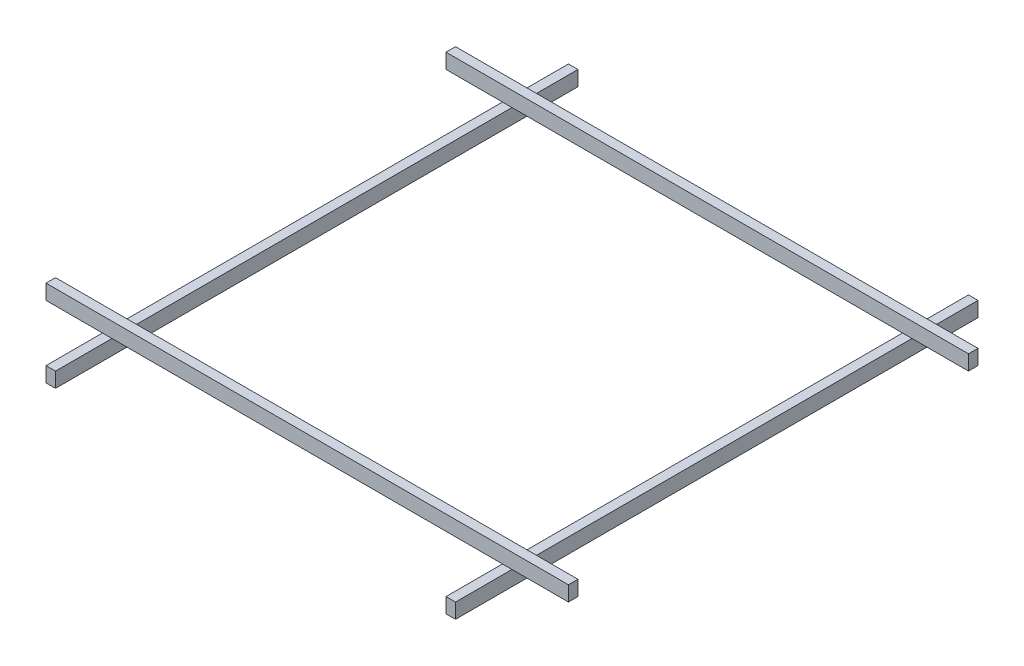
ISO-10303-21;
HEADER;
FILE_DESCRIPTION(('STEP AP214'),'2;1');
FILE_NAME('part.step','',(''),(''),'','','');
FILE_SCHEMA(('AUTOMOTIVE_DESIGN { 1 0 10303 214 1 1 1 1 }'));
ENDSEC;
DATA;
#1=APPLICATION_CONTEXT('core data for automotive mechanical design processes');
#2=APPLICATION_PROTOCOL_DEFINITION('international standard','automotive_design',2000,#1);
#3=PRODUCT_CONTEXT('',#1,'mechanical');
#4=PRODUCT('Part','Part','',(#3));
#5=PRODUCT_RELATED_PRODUCT_CATEGORY('part','',(#4));
#6=PRODUCT_DEFINITION_FORMATION('','',#4);
#7=PRODUCT_DEFINITION_CONTEXT('part definition',#1,'design');
#8=PRODUCT_DEFINITION('design','',#6,#7);
#9=PRODUCT_DEFINITION_SHAPE('','',#8);
#10=(LENGTH_UNIT() NAMED_UNIT(*) SI_UNIT(.MILLI.,.METRE.));
#11=(NAMED_UNIT(*) PLANE_ANGLE_UNIT() SI_UNIT($,.RADIAN.));
#12=(NAMED_UNIT(*) SI_UNIT($,.STERADIAN.) SOLID_ANGLE_UNIT());
#13=UNCERTAINTY_MEASURE_WITH_UNIT(LENGTH_MEASURE(1.E-05),#10,'distance_accuracy_value','');
#14=(GEOMETRIC_REPRESENTATION_CONTEXT(3) GLOBAL_UNCERTAINTY_ASSIGNED_CONTEXT((#13)) GLOBAL_UNIT_ASSIGNED_CONTEXT((#10,
#11,#12)) REPRESENTATION_CONTEXT('',''));
#15=CARTESIAN_POINT('',(0.,0.,0.));
#16=DIRECTION('',(0.,0.,1.));
#17=DIRECTION('',(1.,0.,0.));
#18=AXIS2_PLACEMENT_3D('',#15,#16,#17);
#19=CARTESIAN_POINT('',(4572.,209.55,-615.95));
#20=DIRECTION('',(0.,0.,1.));
#21=DIRECTION('',(1.,0.,0.));
#22=AXIS2_PLACEMENT_3D('',#19,#20,#21);
#23=PLANE('',#22);
#24=DIRECTION('',(0.,1.,0.));
#25=VECTOR('',#24,1.);
#26=CARTESIAN_POINT('',(-304.8,209.55,-615.95));
#27=LINE('',#26,#25);
#28=CARTESIAN_POINT('',(-304.8,69.85,-615.95));
#29=VERTEX_POINT('',#28);
#30=CARTESIAN_POINT('',(-304.8,209.55,-615.95));
#31=VERTEX_POINT('',#30);
#32=EDGE_CURVE('E141',#29,#31,#27,.T.);
#33=ORIENTED_EDGE('',*,*,#32,.T.);
#34=DIRECTION('',(-1.,0.,0.));
#35=VECTOR('',#34,1.);
#36=CARTESIAN_POINT('',(4572.,209.55,-615.95));
#37=LINE('',#36,#35);
#38=CARTESIAN_POINT('',(4572.,209.55,-615.95));
#39=VERTEX_POINT('',#38);
#40=EDGE_CURVE('E13',#39,#31,#37,.T.);
#41=ORIENTED_EDGE('',*,*,#40,.F.);
#42=DIRECTION('',(0.,1.,0.));
#43=VECTOR('',#42,1.);
#44=CARTESIAN_POINT('',(4572.,209.55,-615.95));
#45=LINE('',#44,#43);
#46=CARTESIAN_POINT('',(4572.,69.85,-615.95));
#47=VERTEX_POINT('',#46);
#48=EDGE_CURVE('E125',#47,#39,#45,.T.);
#49=ORIENTED_EDGE('',*,*,#48,.F.);
#50=DIRECTION('',(-1.,0.,0.));
#51=VECTOR('',#50,1.);
#52=CARTESIAN_POINT('',(4572.,69.85,-615.95));
#53=LINE('',#52,#51);
#54=EDGE_CURVE('E137',#47,#29,#53,.T.);
#55=ORIENTED_EDGE('',*,*,#54,.T.);
#56=EDGE_LOOP('',(#33,#41,#49,#55));
#57=FACE_BOUND('',#56,.T.);
#58=ADVANCED_FACE('F69',(#57),#23,.F.);
#59=CARTESIAN_POINT('',(4572.,209.55,-527.05));
#60=DIRECTION('',(0.,-1.,0.));
#61=DIRECTION('',(0.,0.,-1.));
#62=AXIS2_PLACEMENT_3D('',#59,#60,#61);
#63=PLANE('',#62);
#64=DIRECTION('',(0.,0.,1.));
#65=VECTOR('',#64,1.);
#66=CARTESIAN_POINT('',(-304.8,209.55,-527.05));
#67=LINE('',#66,#65);
#68=CARTESIAN_POINT('',(-304.8,209.55,-527.05));
#69=VERTEX_POINT('',#68);
#70=EDGE_CURVE('E130',#31,#69,#67,.T.);
#71=ORIENTED_EDGE('',*,*,#70,.T.);
#72=DIRECTION('',(-1.,0.,0.));
#73=VECTOR('',#72,1.);
#74=CARTESIAN_POINT('',(4572.,209.55,-527.05));
#75=LINE('',#74,#73);
#76=CARTESIAN_POINT('',(4572.,209.55,-527.05));
#77=VERTEX_POINT('',#76);
#78=EDGE_CURVE('E78',#77,#69,#75,.T.);
#79=ORIENTED_EDGE('',*,*,#78,.F.);
#80=DIRECTION('',(0.,0.,1.));
#81=VECTOR('',#80,1.);
#82=CARTESIAN_POINT('',(4572.,209.55,-527.05));
#83=LINE('',#82,#81);
#84=EDGE_CURVE('E120',#39,#77,#83,.T.);
#85=ORIENTED_EDGE('',*,*,#84,.F.);
#86=ORIENTED_EDGE('',*,*,#40,.T.);
#87=EDGE_LOOP('',(#71,#79,#85,#86));
#88=FACE_BOUND('',#87,.T.);
#89=ADVANCED_FACE('F129',(#88),#63,.F.);
#90=CARTESIAN_POINT('',(4572.,209.55,-527.05));
#91=DIRECTION('',(0.,0.,-1.));
#92=DIRECTION('',(-1.,0.,0.));
#93=AXIS2_PLACEMENT_3D('',#90,#91,#92);
#94=PLANE('',#93);
#95=DIRECTION('',(0.,-1.,0.));
#96=VECTOR('',#95,1.);
#97=CARTESIAN_POINT('',(-304.8,209.55,-527.05));
#98=LINE('',#97,#96);
#99=CARTESIAN_POINT('',(-304.8,69.85,-527.05));
#100=VERTEX_POINT('',#99);
#101=EDGE_CURVE('E107',#69,#100,#98,.T.);
#102=ORIENTED_EDGE('',*,*,#101,.T.);
#103=DIRECTION('',(-1.,0.,0.));
#104=VECTOR('',#103,1.);
#105=CARTESIAN_POINT('',(4572.,69.85,-527.05));
#106=LINE('',#105,#104);
#107=CARTESIAN_POINT('',(4572.,69.85,-527.05));
#108=VERTEX_POINT('',#107);
#109=EDGE_CURVE('E132',#108,#100,#106,.T.);
#110=ORIENTED_EDGE('',*,*,#109,.F.);
#111=DIRECTION('',(0.,-1.,0.));
#112=VECTOR('',#111,1.);
#113=CARTESIAN_POINT('',(4572.,209.55,-527.05));
#114=LINE('',#113,#112);
#115=EDGE_CURVE('E123',#77,#108,#114,.T.);
#116=ORIENTED_EDGE('',*,*,#115,.F.);
#117=ORIENTED_EDGE('',*,*,#78,.T.);
#118=EDGE_LOOP('',(#102,#110,#116,#117));
#119=FACE_BOUND('',#118,.T.);
#120=ADVANCED_FACE('F133',(#119),#94,.F.);
#121=CARTESIAN_POINT('',(4572.,69.85,-527.05));
#122=DIRECTION('',(0.,1.,0.));
#123=DIRECTION('',(0.,0.,1.));
#124=AXIS2_PLACEMENT_3D('',#121,#122,#123);
#125=PLANE('',#124);
#126=DIRECTION('',(0.,0.,-1.));
#127=VECTOR('',#126,1.);
#128=CARTESIAN_POINT('',(-304.8,69.85,-527.05));
#129=LINE('',#128,#127);
#130=EDGE_CURVE('E113',#100,#29,#129,.T.);
#131=ORIENTED_EDGE('',*,*,#130,.T.);
#132=ORIENTED_EDGE('',*,*,#54,.F.);
#133=DIRECTION('',(0.,0.,-1.));
#134=VECTOR('',#133,1.);
#135=CARTESIAN_POINT('',(4572.,69.85,-527.05));
#136=LINE('',#135,#134);
#137=EDGE_CURVE('E89',#108,#47,#136,.T.);
#138=ORIENTED_EDGE('',*,*,#137,.F.);
#139=ORIENTED_EDGE('',*,*,#109,.T.);
#140=EDGE_LOOP('',(#131,#132,#138,#139));
#141=FACE_BOUND('',#140,.T.);
#142=ADVANCED_FACE('F150',(#141),#125,.F.);
#143=CARTESIAN_POINT('',(4572.,139.7,-838.2));
#144=DIRECTION('',(1.,0.,0.));
#145=DIRECTION('',(0.,0.,-1.));
#146=AXIS2_PLACEMENT_3D('',#143,#144,#145);
#147=PLANE('',#146);
#148=ORIENTED_EDGE('',*,*,#48,.T.);
#149=ORIENTED_EDGE('',*,*,#84,.T.);
#150=ORIENTED_EDGE('',*,*,#115,.T.);
#151=ORIENTED_EDGE('',*,*,#137,.T.);
#152=EDGE_LOOP('',(#148,#149,#150,#151));
#153=FACE_BOUND('',#152,.T.);
#154=ADVANCED_FACE('F121',(#153),#147,.T.);
#155=CARTESIAN_POINT('',(-304.8,139.7,-838.2));
#156=DIRECTION('',(1.,0.,0.));
#157=DIRECTION('',(0.,0.,-1.));
#158=AXIS2_PLACEMENT_3D('',#155,#156,#157);
#159=PLANE('',#158);
#160=ORIENTED_EDGE('',*,*,#32,.F.);
#161=ORIENTED_EDGE('',*,*,#130,.F.);
#162=ORIENTED_EDGE('',*,*,#101,.F.);
#163=ORIENTED_EDGE('',*,*,#70,.F.);
#164=EDGE_LOOP('',(#160,#161,#162,#163));
#165=FACE_BOUND('',#164,.T.);
#166=ADVANCED_FACE('F153',(#165),#159,.F.);
#167=CLOSED_SHELL('',(#58,#89,#120,#142,#154,#166));
#168=MANIFOLD_SOLID_BREP('B2',#167);
#169=CARTESIAN_POINT('',(4572.,209.55,-4349.75));
#170=DIRECTION('',(0.,0.,1.));
#171=DIRECTION('',(1.,0.,0.));
#172=AXIS2_PLACEMENT_3D('',#169,#170,#171);
#173=PLANE('',#172);
#174=DIRECTION('',(0.,1.,0.));
#175=VECTOR('',#174,1.);
#176=CARTESIAN_POINT('',(-304.8,209.55,-4349.75));
#177=LINE('',#176,#175);
#178=CARTESIAN_POINT('',(-304.8,69.85,-4349.75));
#179=VERTEX_POINT('',#178);
#180=CARTESIAN_POINT('',(-304.8,209.55,-4349.75));
#181=VERTEX_POINT('',#180);
#182=EDGE_CURVE('E317',#179,#181,#177,.T.);
#183=ORIENTED_EDGE('',*,*,#182,.T.);
#184=DIRECTION('',(-1.,0.,0.));
#185=VECTOR('',#184,1.);
#186=CARTESIAN_POINT('',(4572.,209.55,-4349.75));
#187=LINE('',#186,#185);
#188=CARTESIAN_POINT('',(4572.,209.55,-4349.75));
#189=VERTEX_POINT('',#188);
#190=EDGE_CURVE('E67',#189,#181,#187,.T.);
#191=ORIENTED_EDGE('',*,*,#190,.F.);
#192=DIRECTION('',(0.,1.,0.));
#193=VECTOR('',#192,1.);
#194=CARTESIAN_POINT('',(4572.,209.55,-4349.75));
#195=LINE('',#194,#193);
#196=CARTESIAN_POINT('',(4572.,69.85,-4349.75));
#197=VERTEX_POINT('',#196);
#198=EDGE_CURVE('E301',#197,#189,#195,.T.);
#199=ORIENTED_EDGE('',*,*,#198,.F.);
#200=DIRECTION('',(-1.,0.,0.));
#201=VECTOR('',#200,1.);
#202=CARTESIAN_POINT('',(4572.,69.85,-4349.75));
#203=LINE('',#202,#201);
#204=EDGE_CURVE('E313',#197,#179,#203,.T.);
#205=ORIENTED_EDGE('',*,*,#204,.T.);
#206=EDGE_LOOP('',(#183,#191,#199,#205));
#207=FACE_BOUND('',#206,.T.);
#208=ADVANCED_FACE('F241',(#207),#173,.F.);
#209=CARTESIAN_POINT('',(4572.,209.55,-4260.85));
#210=DIRECTION('',(0.,-1.,0.));
#211=DIRECTION('',(0.,0.,-1.));
#212=AXIS2_PLACEMENT_3D('',#209,#210,#211);
#213=PLANE('',#212);
#214=DIRECTION('',(0.,0.,1.));
#215=VECTOR('',#214,1.);
#216=CARTESIAN_POINT('',(-304.8,209.55,-4260.85));
#217=LINE('',#216,#215);
#218=CARTESIAN_POINT('',(-304.8,209.55,-4260.85));
#219=VERTEX_POINT('',#218);
#220=EDGE_CURVE('E306',#181,#219,#217,.T.);
#221=ORIENTED_EDGE('',*,*,#220,.T.);
#222=DIRECTION('',(-1.,0.,0.));
#223=VECTOR('',#222,1.);
#224=CARTESIAN_POINT('',(4572.,209.55,-4260.85));
#225=LINE('',#224,#223);
#226=CARTESIAN_POINT('',(4572.,209.55,-4260.85));
#227=VERTEX_POINT('',#226);
#228=EDGE_CURVE('E250',#227,#219,#225,.T.);
#229=ORIENTED_EDGE('',*,*,#228,.F.);
#230=DIRECTION('',(0.,0.,1.));
#231=VECTOR('',#230,1.);
#232=CARTESIAN_POINT('',(4572.,209.55,-4260.85));
#233=LINE('',#232,#231);
#234=EDGE_CURVE('E296',#189,#227,#233,.T.);
#235=ORIENTED_EDGE('',*,*,#234,.F.);
#236=ORIENTED_EDGE('',*,*,#190,.T.);
#237=EDGE_LOOP('',(#221,#229,#235,#236));
#238=FACE_BOUND('',#237,.T.);
#239=ADVANCED_FACE('F305',(#238),#213,.F.);
#240=CARTESIAN_POINT('',(4572.,209.55,-4260.85));
#241=DIRECTION('',(0.,0.,-1.));
#242=DIRECTION('',(-1.,0.,0.));
#243=AXIS2_PLACEMENT_3D('',#240,#241,#242);
#244=PLANE('',#243);
#245=DIRECTION('',(0.,-1.,0.));
#246=VECTOR('',#245,1.);
#247=CARTESIAN_POINT('',(-304.8,209.55,-4260.85));
#248=LINE('',#247,#246);
#249=CARTESIAN_POINT('',(-304.8,69.85,-4260.85));
#250=VERTEX_POINT('',#249);
#251=EDGE_CURVE('E283',#219,#250,#248,.T.);
#252=ORIENTED_EDGE('',*,*,#251,.T.);
#253=DIRECTION('',(-1.,0.,0.));
#254=VECTOR('',#253,1.);
#255=CARTESIAN_POINT('',(4572.,69.85,-4260.85));
#256=LINE('',#255,#254);
#257=CARTESIAN_POINT('',(4572.,69.85,-4260.85));
#258=VERTEX_POINT('',#257);
#259=EDGE_CURVE('E308',#258,#250,#256,.T.);
#260=ORIENTED_EDGE('',*,*,#259,.F.);
#261=DIRECTION('',(0.,-1.,0.));
#262=VECTOR('',#261,1.);
#263=CARTESIAN_POINT('',(4572.,209.55,-4260.85));
#264=LINE('',#263,#262);
#265=EDGE_CURVE('E299',#227,#258,#264,.T.);
#266=ORIENTED_EDGE('',*,*,#265,.F.);
#267=ORIENTED_EDGE('',*,*,#228,.T.);
#268=EDGE_LOOP('',(#252,#260,#266,#267));
#269=FACE_BOUND('',#268,.T.);
#270=ADVANCED_FACE('F309',(#269),#244,.F.);
#271=CARTESIAN_POINT('',(4572.,69.85,-4260.85));
#272=DIRECTION('',(0.,1.,0.));
#273=DIRECTION('',(0.,0.,1.));
#274=AXIS2_PLACEMENT_3D('',#271,#272,#273);
#275=PLANE('',#274);
#276=DIRECTION('',(0.,0.,-1.));
#277=VECTOR('',#276,1.);
#278=CARTESIAN_POINT('',(-304.8,69.85,-4260.85));
#279=LINE('',#278,#277);
#280=EDGE_CURVE('E289',#250,#179,#279,.T.);
#281=ORIENTED_EDGE('',*,*,#280,.T.);
#282=ORIENTED_EDGE('',*,*,#204,.F.);
#283=DIRECTION('',(0.,0.,-1.));
#284=VECTOR('',#283,1.);
#285=CARTESIAN_POINT('',(4572.,69.85,-4260.85));
#286=LINE('',#285,#284);
#287=EDGE_CURVE('E261',#258,#197,#286,.T.);
#288=ORIENTED_EDGE('',*,*,#287,.F.);
#289=ORIENTED_EDGE('',*,*,#259,.T.);
#290=EDGE_LOOP('',(#281,#282,#288,#289));
#291=FACE_BOUND('',#290,.T.);
#292=ADVANCED_FACE('F330',(#291),#275,.F.);
#293=CARTESIAN_POINT('',(4572.,139.7,-4572.));
#294=DIRECTION('',(1.,0.,0.));
#295=DIRECTION('',(0.,0.,-1.));
#296=AXIS2_PLACEMENT_3D('',#293,#294,#295);
#297=PLANE('',#296);
#298=ORIENTED_EDGE('',*,*,#198,.T.);
#299=ORIENTED_EDGE('',*,*,#234,.T.);
#300=ORIENTED_EDGE('',*,*,#265,.T.);
#301=ORIENTED_EDGE('',*,*,#287,.T.);
#302=EDGE_LOOP('',(#298,#299,#300,#301));
#303=FACE_BOUND('',#302,.T.);
#304=ADVANCED_FACE('F297',(#303),#297,.T.);
#305=CARTESIAN_POINT('',(-304.8,139.7,-4572.));
#306=DIRECTION('',(1.,0.,0.));
#307=DIRECTION('',(0.,0.,-1.));
#308=AXIS2_PLACEMENT_3D('',#305,#306,#307);
#309=PLANE('',#308);
#310=ORIENTED_EDGE('',*,*,#182,.F.);
#311=ORIENTED_EDGE('',*,*,#280,.F.);
#312=ORIENTED_EDGE('',*,*,#251,.F.);
#313=ORIENTED_EDGE('',*,*,#220,.F.);
#314=EDGE_LOOP('',(#310,#311,#312,#313));
#315=FACE_BOUND('',#314,.T.);
#316=ADVANCED_FACE('F333',(#315),#309,.F.);
#317=CLOSED_SHELL('',(#208,#239,#270,#292,#304,#316));
#318=MANIFOLD_SOLID_BREP('B7',#317);
#319=CARTESIAN_POINT('',(3956.05,69.85,-4876.8));
#320=DIRECTION('',(1.,0.,0.));
#321=DIRECTION('',(0.,0.,-1.));
#322=AXIS2_PLACEMENT_3D('',#319,#320,#321);
#323=PLANE('',#322);
#324=DIRECTION('',(0.,1.,0.));
#325=VECTOR('',#324,1.);
#326=CARTESIAN_POINT('',(3956.05,69.85,0.));
#327=LINE('',#326,#325);
#328=CARTESIAN_POINT('',(3956.05,-69.85,0.));
#329=VERTEX_POINT('',#328);
#330=CARTESIAN_POINT('',(3956.05,69.85,0.));
#331=VERTEX_POINT('',#330);
#332=EDGE_CURVE('E493',#329,#331,#327,.T.);
#333=ORIENTED_EDGE('',*,*,#332,.T.);
#334=DIRECTION('',(0.,0.,1.));
#335=VECTOR('',#334,1.);
#336=CARTESIAN_POINT('',(3956.05,69.85,-4876.8));
#337=LINE('',#336,#335);
#338=CARTESIAN_POINT('',(3956.05,69.85,-4876.8));
#339=VERTEX_POINT('',#338);
#340=EDGE_CURVE('E239',#339,#331,#337,.T.);
#341=ORIENTED_EDGE('',*,*,#340,.F.);
#342=DIRECTION('',(0.,1.,0.));
#343=VECTOR('',#342,1.);
#344=CARTESIAN_POINT('',(3956.05,69.85,-4876.8));
#345=LINE('',#344,#343);
#346=CARTESIAN_POINT('',(3956.05,-69.85,-4876.8));
#347=VERTEX_POINT('',#346);
#348=EDGE_CURVE('E477',#347,#339,#345,.T.);
#349=ORIENTED_EDGE('',*,*,#348,.F.);
#350=DIRECTION('',(0.,0.,1.));
#351=VECTOR('',#350,1.);
#352=CARTESIAN_POINT('',(3956.05,-69.85,-4876.8));
#353=LINE('',#352,#351);
#354=EDGE_CURVE('E489',#347,#329,#353,.T.);
#355=ORIENTED_EDGE('',*,*,#354,.T.);
#356=EDGE_LOOP('',(#333,#341,#349,#355));
#357=FACE_BOUND('',#356,.T.);
#358=ADVANCED_FACE('F421',(#357),#323,.F.);
#359=CARTESIAN_POINT('',(4044.95,69.85,-4876.8));
#360=DIRECTION('',(0.,-1.,0.));
#361=DIRECTION('',(0.,0.,-1.));
#362=AXIS2_PLACEMENT_3D('',#359,#360,#361);
#363=PLANE('',#362);
#364=DIRECTION('',(1.,0.,0.));
#365=VECTOR('',#364,1.);
#366=CARTESIAN_POINT('',(4044.95,69.85,0.));
#367=LINE('',#366,#365);
#368=CARTESIAN_POINT('',(4044.95,69.85,0.));
#369=VERTEX_POINT('',#368);
#370=EDGE_CURVE('E482',#331,#369,#367,.T.);
#371=ORIENTED_EDGE('',*,*,#370,.T.);
#372=DIRECTION('',(0.,0.,1.));
#373=VECTOR('',#372,1.);
#374=CARTESIAN_POINT('',(4044.95,69.85,-4876.8));
#375=LINE('',#374,#373);
#376=CARTESIAN_POINT('',(4044.95,69.85,-4876.8));
#377=VERTEX_POINT('',#376);
#378=EDGE_CURVE('E430',#377,#369,#375,.T.);
#379=ORIENTED_EDGE('',*,*,#378,.F.);
#380=DIRECTION('',(1.,0.,0.));
#381=VECTOR('',#380,1.);
#382=CARTESIAN_POINT('',(4044.95,69.85,-4876.8));
#383=LINE('',#382,#381);
#384=EDGE_CURVE('E472',#339,#377,#383,.T.);
#385=ORIENTED_EDGE('',*,*,#384,.F.);
#386=ORIENTED_EDGE('',*,*,#340,.T.);
#387=EDGE_LOOP('',(#371,#379,#385,#386));
#388=FACE_BOUND('',#387,.T.);
#389=ADVANCED_FACE('F481',(#388),#363,.F.);
#390=CARTESIAN_POINT('',(4044.95,69.85,-4876.8));
#391=DIRECTION('',(-1.,0.,0.));
#392=DIRECTION('',(0.,0.,1.));
#393=AXIS2_PLACEMENT_3D('',#390,#391,#392);
#394=PLANE('',#393);
#395=DIRECTION('',(0.,-1.,0.));
#396=VECTOR('',#395,1.);
#397=CARTESIAN_POINT('',(4044.95,69.85,0.));
#398=LINE('',#397,#396);
#399=CARTESIAN_POINT('',(4044.95,-69.85,0.));
#400=VERTEX_POINT('',#399);
#401=EDGE_CURVE('E459',#369,#400,#398,.T.);
#402=ORIENTED_EDGE('',*,*,#401,.T.);
#403=DIRECTION('',(0.,0.,1.));
#404=VECTOR('',#403,1.);
#405=CARTESIAN_POINT('',(4044.95,-69.85,-4876.8));
#406=LINE('',#405,#404);
#407=CARTESIAN_POINT('',(4044.95,-69.85,-4876.8));
#408=VERTEX_POINT('',#407);
#409=EDGE_CURVE('E484',#408,#400,#406,.T.);
#410=ORIENTED_EDGE('',*,*,#409,.F.);
#411=DIRECTION('',(0.,-1.,0.));
#412=VECTOR('',#411,1.);
#413=CARTESIAN_POINT('',(4044.95,69.85,-4876.8));
#414=LINE('',#413,#412);
#415=EDGE_CURVE('E475',#377,#408,#414,.T.);
#416=ORIENTED_EDGE('',*,*,#415,.F.);
#417=ORIENTED_EDGE('',*,*,#378,.T.);
#418=EDGE_LOOP('',(#402,#410,#416,#417));
#419=FACE_BOUND('',#418,.T.);
#420=ADVANCED_FACE('F485',(#419),#394,.F.);
#421=CARTESIAN_POINT('',(4044.95,-69.85,-4876.8));
#422=DIRECTION('',(0.,1.,0.));
#423=DIRECTION('',(0.,0.,1.));
#424=AXIS2_PLACEMENT_3D('',#421,#422,#423);
#425=PLANE('',#424);
#426=DIRECTION('',(-1.,0.,0.));
#427=VECTOR('',#426,1.);
#428=CARTESIAN_POINT('',(4044.95,-69.85,0.));
#429=LINE('',#428,#427);
#430=EDGE_CURVE('E465',#400,#329,#429,.T.);
#431=ORIENTED_EDGE('',*,*,#430,.T.);
#432=ORIENTED_EDGE('',*,*,#354,.F.);
#433=DIRECTION('',(-1.,0.,0.));
#434=VECTOR('',#433,1.);
#435=CARTESIAN_POINT('',(4044.95,-69.85,-4876.8));
#436=LINE('',#435,#434);
#437=EDGE_CURVE('E441',#408,#347,#436,.T.);
#438=ORIENTED_EDGE('',*,*,#437,.F.);
#439=ORIENTED_EDGE('',*,*,#409,.T.);
#440=EDGE_LOOP('',(#431,#432,#438,#439));
#441=FACE_BOUND('',#440,.T.);
#442=ADVANCED_FACE('F502',(#441),#425,.F.);
#443=CARTESIAN_POINT('',(3733.8,0.,-4876.8));
#444=DIRECTION('',(0.,0.,-1.));
#445=DIRECTION('',(-1.,0.,0.));
#446=AXIS2_PLACEMENT_3D('',#443,#444,#445);
#447=PLANE('',#446);
#448=ORIENTED_EDGE('',*,*,#348,.T.);
#449=ORIENTED_EDGE('',*,*,#384,.T.);
#450=ORIENTED_EDGE('',*,*,#415,.T.);
#451=ORIENTED_EDGE('',*,*,#437,.T.);
#452=EDGE_LOOP('',(#448,#449,#450,#451));
#453=FACE_BOUND('',#452,.T.);
#454=ADVANCED_FACE('F473',(#453),#447,.T.);
#455=CARTESIAN_POINT('',(3733.8,0.,0.));
#456=DIRECTION('',(0.,0.,-1.));
#457=DIRECTION('',(-1.,0.,0.));
#458=AXIS2_PLACEMENT_3D('',#455,#456,#457);
#459=PLANE('',#458);
#460=ORIENTED_EDGE('',*,*,#332,.F.);
#461=ORIENTED_EDGE('',*,*,#430,.F.);
#462=ORIENTED_EDGE('',*,*,#401,.F.);
#463=ORIENTED_EDGE('',*,*,#370,.F.);
#464=EDGE_LOOP('',(#460,#461,#462,#463));
#465=FACE_BOUND('',#464,.T.);
#466=ADVANCED_FACE('F505',(#465),#459,.F.);
#467=CLOSED_SHELL('',(#358,#389,#420,#442,#454,#466));
#468=MANIFOLD_SOLID_BREP('B61',#467);
#469=CARTESIAN_POINT('',(222.25,69.85,-4876.8));
#470=DIRECTION('',(1.,0.,0.));
#471=DIRECTION('',(0.,0.,-1.));
#472=AXIS2_PLACEMENT_3D('',#469,#470,#471);
#473=PLANE('',#472);
#474=DIRECTION('',(0.,1.,0.));
#475=VECTOR('',#474,1.);
#476=CARTESIAN_POINT('',(222.25,69.85,8.88178419700125E-13));
#477=LINE('',#476,#475);
#478=CARTESIAN_POINT('',(222.25,-69.85,8.88178419700125E-13));
#479=VERTEX_POINT('',#478);
#480=CARTESIAN_POINT('',(222.25,69.85,8.88178419700125E-13));
#481=VERTEX_POINT('',#480);
#482=EDGE_CURVE('E659',#479,#481,#477,.T.);
#483=ORIENTED_EDGE('',*,*,#482,.T.);
#484=DIRECTION('',(0.,0.,1.));
#485=VECTOR('',#484,1.);
#486=CARTESIAN_POINT('',(222.25,69.85,-4876.8));
#487=LINE('',#486,#485);
#488=CARTESIAN_POINT('',(222.25,69.85,-4876.8));
#489=VERTEX_POINT('',#488);
#490=EDGE_CURVE('E419',#489,#481,#487,.T.);
#491=ORIENTED_EDGE('',*,*,#490,.F.);
#492=DIRECTION('',(0.,1.,0.));
#493=VECTOR('',#492,1.);
#494=CARTESIAN_POINT('',(222.25,69.85,-4876.8));
#495=LINE('',#494,#493);
#496=CARTESIAN_POINT('',(222.25,-69.85,-4876.8));
#497=VERTEX_POINT('',#496);
#498=EDGE_CURVE('E642',#497,#489,#495,.T.);
#499=ORIENTED_EDGE('',*,*,#498,.F.);
#500=DIRECTION('',(0.,0.,1.));
#501=VECTOR('',#500,1.);
#502=CARTESIAN_POINT('',(222.25,-69.85,-4876.8));
#503=LINE('',#502,#501);
#504=EDGE_CURVE('E655',#497,#479,#503,.T.);
#505=ORIENTED_EDGE('',*,*,#504,.T.);
#506=EDGE_LOOP('',(#483,#491,#499,#505));
#507=FACE_BOUND('',#506,.T.);
#508=ADVANCED_FACE('F583',(#507),#473,.F.);
#509=CARTESIAN_POINT('',(311.15,69.85,-4876.8));
#510=DIRECTION('',(0.,-1.,0.));
#511=DIRECTION('',(0.,0.,-1.));
#512=AXIS2_PLACEMENT_3D('',#509,#510,#511);
#513=PLANE('',#512);
#514=DIRECTION('',(1.,0.,0.));
#515=VECTOR('',#514,1.);
#516=CARTESIAN_POINT('',(311.15,69.85,8.88178419700125E-13));
#517=LINE('',#516,#515);
#518=CARTESIAN_POINT('',(311.15,69.85,8.88178419700125E-13));
#519=VERTEX_POINT('',#518);
#520=EDGE_CURVE('E647',#481,#519,#517,.T.);
#521=ORIENTED_EDGE('',*,*,#520,.T.);
#522=DIRECTION('',(0.,0.,1.));
#523=VECTOR('',#522,1.);
#524=CARTESIAN_POINT('',(311.15,69.85,-4876.8));
#525=LINE('',#524,#523);
#526=CARTESIAN_POINT('',(311.15,69.85,-4876.8));
#527=VERTEX_POINT('',#526);
#528=EDGE_CURVE('E592',#527,#519,#525,.T.);
#529=ORIENTED_EDGE('',*,*,#528,.F.);
#530=DIRECTION('',(1.,0.,0.));
#531=VECTOR('',#530,1.);
#532=CARTESIAN_POINT('',(311.15,69.85,-4876.8));
#533=LINE('',#532,#531);
#534=EDGE_CURVE('E637',#489,#527,#533,.T.);
#535=ORIENTED_EDGE('',*,*,#534,.F.);
#536=ORIENTED_EDGE('',*,*,#490,.T.);
#537=EDGE_LOOP('',(#521,#529,#535,#536));
#538=FACE_BOUND('',#537,.T.);
#539=ADVANCED_FACE('F646',(#538),#513,.F.);
#540=CARTESIAN_POINT('',(311.15,69.85,-4876.8));
#541=DIRECTION('',(-1.,0.,0.));
#542=DIRECTION('',(0.,0.,1.));
#543=AXIS2_PLACEMENT_3D('',#540,#541,#542);
#544=PLANE('',#543);
#545=DIRECTION('',(0.,-1.,0.));
#546=VECTOR('',#545,1.);
#547=CARTESIAN_POINT('',(311.15,69.85,8.88178419700125E-13));
#548=LINE('',#547,#546);
#549=CARTESIAN_POINT('',(311.15,-69.85,8.88178419700125E-13));
#550=VERTEX_POINT('',#549);
#551=EDGE_CURVE('E623',#519,#550,#548,.T.);
#552=ORIENTED_EDGE('',*,*,#551,.T.);
#553=DIRECTION('',(0.,0.,1.));
#554=VECTOR('',#553,1.);
#555=CARTESIAN_POINT('',(311.15,-69.85,-4876.8));
#556=LINE('',#555,#554);
#557=CARTESIAN_POINT('',(311.15,-69.85,-4876.8));
#558=VERTEX_POINT('',#557);
#559=EDGE_CURVE('E649',#558,#550,#556,.T.);
#560=ORIENTED_EDGE('',*,*,#559,.F.);
#561=DIRECTION('',(0.,-1.,0.));
#562=VECTOR('',#561,1.);
#563=CARTESIAN_POINT('',(311.15,69.85,-4876.8));
#564=LINE('',#563,#562);
#565=EDGE_CURVE('E640',#527,#558,#564,.T.);
#566=ORIENTED_EDGE('',*,*,#565,.F.);
#567=ORIENTED_EDGE('',*,*,#528,.T.);
#568=EDGE_LOOP('',(#552,#560,#566,#567));
#569=FACE_BOUND('',#568,.T.);
#570=ADVANCED_FACE('F650',(#569),#544,.F.);
#571=CARTESIAN_POINT('',(311.15,-69.85,-4876.8));
#572=DIRECTION('',(0.,1.,0.));
#573=DIRECTION('',(0.,0.,1.));
#574=AXIS2_PLACEMENT_3D('',#571,#572,#573);
#575=PLANE('',#574);
#576=DIRECTION('',(-1.,0.,0.));
#577=VECTOR('',#576,1.);
#578=CARTESIAN_POINT('',(311.15,-69.85,8.88178419700125E-13));
#579=LINE('',#578,#577);
#580=EDGE_CURVE('E630',#550,#479,#579,.T.);
#581=ORIENTED_EDGE('',*,*,#580,.T.);
#582=ORIENTED_EDGE('',*,*,#504,.F.);
#583=DIRECTION('',(-1.,0.,0.));
#584=VECTOR('',#583,1.);
#585=CARTESIAN_POINT('',(311.15,-69.85,-4876.8));
#586=LINE('',#585,#584);
#587=EDGE_CURVE('E603',#558,#497,#586,.T.);
#588=ORIENTED_EDGE('',*,*,#587,.F.);
#589=ORIENTED_EDGE('',*,*,#559,.T.);
#590=EDGE_LOOP('',(#581,#582,#588,#589));
#591=FACE_BOUND('',#590,.T.);
#592=ADVANCED_FACE('F671',(#591),#575,.F.);
#593=CARTESIAN_POINT('',(0.,0.,-4876.8));
#594=DIRECTION('',(0.,0.,-1.));
#595=DIRECTION('',(-1.,0.,0.));
#596=AXIS2_PLACEMENT_3D('',#593,#594,#595);
#597=PLANE('',#596);
#598=ORIENTED_EDGE('',*,*,#498,.T.);
#599=ORIENTED_EDGE('',*,*,#534,.T.);
#600=ORIENTED_EDGE('',*,*,#565,.T.);
#601=ORIENTED_EDGE('',*,*,#587,.T.);
#602=EDGE_LOOP('',(#598,#599,#600,#601));
#603=FACE_BOUND('',#602,.T.);
#604=ADVANCED_FACE('F638',(#603),#597,.T.);
#605=CARTESIAN_POINT('',(0.,0.,8.88178419700125E-13));
#606=DIRECTION('',(0.,0.,-1.));
#607=DIRECTION('',(-1.,0.,0.));
#608=AXIS2_PLACEMENT_3D('',#605,#606,#607);
#609=PLANE('',#608);
#610=ORIENTED_EDGE('',*,*,#482,.F.);
#611=ORIENTED_EDGE('',*,*,#580,.F.);
#612=ORIENTED_EDGE('',*,*,#551,.F.);
#613=ORIENTED_EDGE('',*,*,#520,.F.);
#614=EDGE_LOOP('',(#610,#611,#612,#613));
#615=FACE_BOUND('',#614,.T.);
#616=ADVANCED_FACE('F674',(#615),#609,.F.);
#617=CLOSED_SHELL('',(#508,#539,#570,#592,#604,#616));
#618=MANIFOLD_SOLID_BREP('B233',#617);
#619=ADVANCED_BREP_SHAPE_REPRESENTATION('',(#18,#168,#318,#468,#618),#14);
#620=SHAPE_DEFINITION_REPRESENTATION(#9,#619);
ENDSEC;
END-ISO-10303-21;
